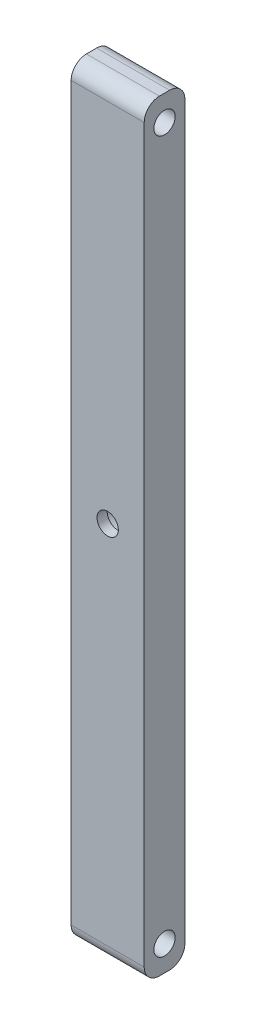
ISO-10303-21;
HEADER;
FILE_DESCRIPTION(('STEP AP214'),'2;1');
FILE_NAME('part.step','',(''),(''),'','','');
FILE_SCHEMA(('AUTOMOTIVE_DESIGN { 1 0 10303 214 1 1 1 1 }'));
ENDSEC;
DATA;
#1=APPLICATION_CONTEXT('core data for automotive mechanical design processes');
#2=APPLICATION_PROTOCOL_DEFINITION('international standard','automotive_design',2000,#1);
#3=PRODUCT_CONTEXT('',#1,'mechanical');
#4=PRODUCT('Part','Part','',(#3));
#5=PRODUCT_RELATED_PRODUCT_CATEGORY('part','',(#4));
#6=PRODUCT_DEFINITION_FORMATION('','',#4);
#7=PRODUCT_DEFINITION_CONTEXT('part definition',#1,'design');
#8=PRODUCT_DEFINITION('design','',#6,#7);
#9=PRODUCT_DEFINITION_SHAPE('','',#8);
#10=(LENGTH_UNIT() NAMED_UNIT(*) SI_UNIT(.MILLI.,.METRE.));
#11=(NAMED_UNIT(*) PLANE_ANGLE_UNIT() SI_UNIT($,.RADIAN.));
#12=(NAMED_UNIT(*) SI_UNIT($,.STERADIAN.) SOLID_ANGLE_UNIT());
#13=UNCERTAINTY_MEASURE_WITH_UNIT(LENGTH_MEASURE(1.E-05),#10,'distance_accuracy_value','');
#14=(GEOMETRIC_REPRESENTATION_CONTEXT(3) GLOBAL_UNCERTAINTY_ASSIGNED_CONTEXT((#13)) GLOBAL_UNIT_ASSIGNED_CONTEXT((#10,
#11,#12)) REPRESENTATION_CONTEXT('',''));
#15=CARTESIAN_POINT('',(0.,0.,0.));
#16=DIRECTION('',(0.,0.,1.));
#17=DIRECTION('',(1.,0.,0.));
#18=AXIS2_PLACEMENT_3D('',#15,#16,#17);
#19=CARTESIAN_POINT('',(0.,0.,-136.198862981558));
#20=DIRECTION('',(0.,0.,-1.));
#21=DIRECTION('',(-1.,0.,0.));
#22=AXIS2_PLACEMENT_3D('',#19,#20,#21);
#23=PLANE('',#22);
#24=CARTESIAN_POINT('',(52.7153260754915,163.447805518619,-136.198862981558));
#25=DIRECTION('',(0.,0.,-1.));
#26=DIRECTION('',(-1.,0.,0.));
#27=AXIS2_PLACEMENT_3D('',#24,#25,#26);
#28=CIRCLE('',#27,2.1);
#29=CARTESIAN_POINT('',(50.6153260754914,163.447805518619,-136.198862981558));
#30=VERTEX_POINT('',#29);
#31=EDGE_CURVE('E153',#30,#30,#28,.T.);
#32=ORIENTED_EDGE('',*,*,#31,.F.);
#33=EDGE_LOOP('',(#32));
#34=FACE_BOUND('',#33,.T.);
#35=CARTESIAN_POINT('',(52.7153260754915,163.447805518619,-136.198862981558));
#36=DIRECTION('',(0.,0.,-1.));
#37=DIRECTION('',(-1.,0.,0.));
#38=AXIS2_PLACEMENT_3D('',#35,#36,#37);
#39=CIRCLE('',#38,4.00000000000001);
#40=CARTESIAN_POINT('',(48.7153260754914,163.447805518619,-136.198862981558));
#41=VERTEX_POINT('',#40);
#42=EDGE_CURVE('E254',#41,#41,#39,.T.);
#43=ORIENTED_EDGE('',*,*,#42,.T.);
#44=EDGE_LOOP('',(#43));
#45=FACE_BOUND('',#44,.T.);
#46=ADVANCED_FACE('F41',(#34,#45),#23,.T.);
#47=CARTESIAN_POINT('',(0.,88.4478055186193,-136.198862981558));
#48=DIRECTION('',(0.,1.,0.));
#49=DIRECTION('',(0.,0.,1.));
#50=AXIS2_PLACEMENT_3D('',#47,#48,#49);
#51=PLANE('',#50);
#52=DIRECTION('',(0.,0.,1.));
#53=VECTOR('',#52,1.);
#54=CARTESIAN_POINT('',(59.9067960824093,88.4478055186193,-136.198862981558));
#55=LINE('',#54,#53);
#56=CARTESIAN_POINT('',(59.9067960824093,88.4478055186193,-139.198862981558));
#57=VERTEX_POINT('',#56);
#58=CARTESIAN_POINT('',(59.9067960824093,88.4478055186193,-137.198862981558));
#59=VERTEX_POINT('',#58);
#60=EDGE_CURVE('E149',#57,#59,#55,.T.);
#61=ORIENTED_EDGE('',*,*,#60,.T.);
#62=DIRECTION('',(-1.,0.,0.));
#63=VECTOR('',#62,1.);
#64=CARTESIAN_POINT('',(0.,88.4478055186193,-137.198862981558));
#65=LINE('',#64,#63);
#66=CARTESIAN_POINT('',(45.5238560685736,88.4478055186193,-137.198862981558));
#67=VERTEX_POINT('',#66);
#68=EDGE_CURVE('E11',#59,#67,#65,.T.);
#69=ORIENTED_EDGE('',*,*,#68,.T.);
#70=DIRECTION('',(0.,0.,1.));
#71=VECTOR('',#70,1.);
#72=CARTESIAN_POINT('',(45.5238560685736,88.4478055186193,-136.198862981558));
#73=LINE('',#72,#71);
#74=CARTESIAN_POINT('',(45.5238560685736,88.4478055186193,-139.198862981558));
#75=VERTEX_POINT('',#74);
#76=EDGE_CURVE('E122',#75,#67,#73,.T.);
#77=ORIENTED_EDGE('',*,*,#76,.F.);
#78=DIRECTION('',(-1.,0.,0.));
#79=VECTOR('',#78,1.);
#80=CARTESIAN_POINT('',(59.9067960824093,88.4478055186193,-139.198862981558));
#81=LINE('',#80,#79);
#82=EDGE_CURVE('E49',#75,#57,#81,.F.);
#83=ORIENTED_EDGE('',*,*,#82,.T.);
#84=EDGE_LOOP('',(#61,#69,#77,#83));
#85=FACE_BOUND('',#84,.T.);
#86=ADVANCED_FACE('F148',(#85),#51,.F.);
#87=CARTESIAN_POINT('',(45.5238560685736,0.,-136.198862981558));
#88=DIRECTION('',(1.,0.,0.));
#89=DIRECTION('',(0.,0.,-1.));
#90=AXIS2_PLACEMENT_3D('',#87,#88,#89);
#91=PLANE('',#90);
#92=CARTESIAN_POINT('',(45.5238560685736,93.4478055186193,-138.198862981558));
#93=DIRECTION('',(-1.,0.,0.));
#94=DIRECTION('',(0.,0.,1.));
#95=AXIS2_PLACEMENT_3D('',#92,#93,#94);
#96=CIRCLE('',#95,3.09999999999999);
#97=CARTESIAN_POINT('',(45.5238560685736,93.4478055186193,-135.098862981558));
#98=VERTEX_POINT('',#97);
#99=EDGE_CURVE('E238',#98,#98,#96,.T.);
#100=ORIENTED_EDGE('',*,*,#99,.F.);
#101=EDGE_LOOP('',(#100));
#102=FACE_BOUND('',#101,.T.);
#103=CARTESIAN_POINT('',(45.5238560685736,233.447805518619,-138.198862981558));
#104=DIRECTION('',(-1.,0.,0.));
#105=DIRECTION('',(0.,0.,1.));
#106=AXIS2_PLACEMENT_3D('',#103,#104,#105);
#107=CIRCLE('',#106,3.09999999999999);
#108=CARTESIAN_POINT('',(45.5238560685736,233.447805518619,-135.098862981558));
#109=VERTEX_POINT('',#108);
#110=EDGE_CURVE('E241',#109,#109,#107,.T.);
#111=ORIENTED_EDGE('',*,*,#110,.F.);
#112=EDGE_LOOP('',(#111));
#113=FACE_BOUND('',#112,.T.);
#114=DIRECTION('',(0.,1.,0.));
#115=VECTOR('',#114,1.);
#116=CARTESIAN_POINT('',(45.5238560685736,0.,-134.198862981558));
#117=LINE('',#116,#115);
#118=CARTESIAN_POINT('',(45.5238560685736,91.4478055186193,-134.198862981558));
#119=VERTEX_POINT('',#118);
#120=CARTESIAN_POINT('',(45.5238560685736,235.447805518619,-134.198862981558));
#121=VERTEX_POINT('',#120);
#122=EDGE_CURVE('E118',#119,#121,#117,.T.);
#123=ORIENTED_EDGE('',*,*,#122,.T.);
#124=CARTESIAN_POINT('',(45.5238560685736,235.447805518619,-137.198862981558));
#125=DIRECTION('',(1.,0.,0.));
#126=DIRECTION('',(0.,0.,-1.));
#127=AXIS2_PLACEMENT_3D('',#124,#125,#126);
#128=CIRCLE('',#127,3.);
#129=CARTESIAN_POINT('',(45.5238560685736,238.447805518619,-137.198862981558));
#130=VERTEX_POINT('',#129);
#131=EDGE_CURVE('E189',#121,#130,#128,.F.);
#132=ORIENTED_EDGE('',*,*,#131,.T.);
#133=DIRECTION('',(0.,0.,1.));
#134=VECTOR('',#133,1.);
#135=CARTESIAN_POINT('',(45.5238560685736,238.447805518619,-136.198862981558));
#136=LINE('',#135,#134);
#137=CARTESIAN_POINT('',(45.5238560685736,238.447805518619,-139.198862981558));
#138=VERTEX_POINT('',#137);
#139=EDGE_CURVE('E180',#138,#130,#136,.T.);
#140=ORIENTED_EDGE('',*,*,#139,.F.);
#141=CARTESIAN_POINT('',(45.5238560685736,235.447805518619,-139.198862981558));
#142=DIRECTION('',(1.,0.,0.));
#143=DIRECTION('',(0.,0.,-1.));
#144=AXIS2_PLACEMENT_3D('',#141,#142,#143);
#145=CIRCLE('',#144,3.);
#146=CARTESIAN_POINT('',(45.5238560685736,235.447805518619,-142.198862981558));
#147=VERTEX_POINT('',#146);
#148=EDGE_CURVE('E168',#138,#147,#145,.F.);
#149=ORIENTED_EDGE('',*,*,#148,.T.);
#150=DIRECTION('',(0.,1.,0.));
#151=VECTOR('',#150,1.);
#152=CARTESIAN_POINT('',(45.5238560685736,88.4478055186193,-142.198862981558));
#153=LINE('',#152,#151);
#154=CARTESIAN_POINT('',(45.5238560685736,91.4478055186193,-142.198862981558));
#155=VERTEX_POINT('',#154);
#156=EDGE_CURVE('E162',#155,#147,#153,.T.);
#157=ORIENTED_EDGE('',*,*,#156,.F.);
#158=CARTESIAN_POINT('',(45.5238560685736,91.4478055186193,-139.198862981558));
#159=DIRECTION('',(1.,0.,0.));
#160=DIRECTION('',(0.,0.,-1.));
#161=AXIS2_PLACEMENT_3D('',#158,#159,#160);
#162=CIRCLE('',#161,3.);
#163=EDGE_CURVE('E156',#155,#75,#162,.F.);
#164=ORIENTED_EDGE('',*,*,#163,.T.);
#165=ORIENTED_EDGE('',*,*,#76,.T.);
#166=CARTESIAN_POINT('',(45.5238560685736,91.4478055186193,-137.198862981558));
#167=DIRECTION('',(1.,0.,0.));
#168=DIRECTION('',(0.,0.,-1.));
#169=AXIS2_PLACEMENT_3D('',#166,#167,#168);
#170=CIRCLE('',#169,3.);
#171=EDGE_CURVE('E186',#67,#119,#170,.F.);
#172=ORIENTED_EDGE('',*,*,#171,.T.);
#173=EDGE_LOOP('',(#123,#132,#140,#149,#157,#164,#165,#172));
#174=FACE_BOUND('',#173,.T.);
#175=ADVANCED_FACE('F165',(#102,#113,#174),#91,.F.);
#176=CARTESIAN_POINT('',(0.,238.447805518619,-136.198862981558));
#177=DIRECTION('',(0.,1.,0.));
#178=DIRECTION('',(0.,0.,1.));
#179=AXIS2_PLACEMENT_3D('',#176,#177,#178);
#180=PLANE('',#179);
#181=ORIENTED_EDGE('',*,*,#139,.T.);
#182=DIRECTION('',(-1.,0.,0.));
#183=VECTOR('',#182,1.);
#184=CARTESIAN_POINT('',(59.9067960824093,238.447805518619,-137.198862981558));
#185=LINE('',#184,#183);
#186=CARTESIAN_POINT('',(59.9067960824093,238.447805518619,-137.198862981558));
#187=VERTEX_POINT('',#186);
#188=EDGE_CURVE('E136',#130,#187,#185,.F.);
#189=ORIENTED_EDGE('',*,*,#188,.T.);
#190=DIRECTION('',(0.,0.,1.));
#191=VECTOR('',#190,1.);
#192=CARTESIAN_POINT('',(59.9067960824093,238.447805518619,-136.198862981558));
#193=LINE('',#192,#191);
#194=CARTESIAN_POINT('',(59.9067960824093,238.447805518619,-139.198862981558));
#195=VERTEX_POINT('',#194);
#196=EDGE_CURVE('E152',#195,#187,#193,.T.);
#197=ORIENTED_EDGE('',*,*,#196,.F.);
#198=DIRECTION('',(1.,0.,0.));
#199=VECTOR('',#198,1.);
#200=CARTESIAN_POINT('',(0.,238.447805518619,-139.198862981558));
#201=LINE('',#200,#199);
#202=EDGE_CURVE('E191',#195,#138,#201,.F.);
#203=ORIENTED_EDGE('',*,*,#202,.T.);
#204=EDGE_LOOP('',(#181,#189,#197,#203));
#205=FACE_BOUND('',#204,.T.);
#206=ADVANCED_FACE('F195',(#205),#180,.T.);
#207=CARTESIAN_POINT('',(59.9067960824093,0.,-136.198862981558));
#208=DIRECTION('',(1.,0.,0.));
#209=DIRECTION('',(0.,0.,-1.));
#210=AXIS2_PLACEMENT_3D('',#207,#208,#209);
#211=PLANE('',#210);
#212=CARTESIAN_POINT('',(59.9067960824093,233.447805518619,-138.198862981558));
#213=DIRECTION('',(-1.,0.,0.));
#214=DIRECTION('',(0.,0.,1.));
#215=AXIS2_PLACEMENT_3D('',#212,#213,#214);
#216=CIRCLE('',#215,2.09999999999999);
#217=CARTESIAN_POINT('',(59.9067960824093,233.447805518619,-136.098862981558));
#218=VERTEX_POINT('',#217);
#219=EDGE_CURVE('E244',#218,#218,#216,.T.);
#220=ORIENTED_EDGE('',*,*,#219,.T.);
#221=EDGE_LOOP('',(#220));
#222=FACE_BOUND('',#221,.T.);
#223=CARTESIAN_POINT('',(59.9067960824093,93.4478055186193,-138.198862981558));
#224=DIRECTION('',(-1.,0.,0.));
#225=DIRECTION('',(0.,0.,1.));
#226=AXIS2_PLACEMENT_3D('',#223,#224,#225);
#227=CIRCLE('',#226,2.09999999999999);
#228=CARTESIAN_POINT('',(59.9067960824093,93.4478055186193,-136.098862981558));
#229=VERTEX_POINT('',#228);
#230=EDGE_CURVE('E266',#229,#229,#227,.T.);
#231=ORIENTED_EDGE('',*,*,#230,.T.);
#232=EDGE_LOOP('',(#231));
#233=FACE_BOUND('',#232,.T.);
#234=ORIENTED_EDGE('',*,*,#196,.T.);
#235=CARTESIAN_POINT('',(59.9067960824093,235.447805518619,-137.198862981558));
#236=DIRECTION('',(1.,0.,0.));
#237=DIRECTION('',(0.,0.,-1.));
#238=AXIS2_PLACEMENT_3D('',#235,#236,#237);
#239=CIRCLE('',#238,3.);
#240=CARTESIAN_POINT('',(59.9067960824093,235.447805518619,-134.198862981558));
#241=VERTEX_POINT('',#240);
#242=EDGE_CURVE('E129',#187,#241,#239,.T.);
#243=ORIENTED_EDGE('',*,*,#242,.T.);
#244=DIRECTION('',(0.,1.,0.));
#245=VECTOR('',#244,1.);
#246=CARTESIAN_POINT('',(59.9067960824093,0.,-134.198862981558));
#247=LINE('',#246,#245);
#248=CARTESIAN_POINT('',(59.9067960824093,91.4478055186193,-134.198862981558));
#249=VERTEX_POINT('',#248);
#250=EDGE_CURVE('E115',#249,#241,#247,.T.);
#251=ORIENTED_EDGE('',*,*,#250,.F.);
#252=CARTESIAN_POINT('',(59.9067960824093,91.4478055186193,-137.198862981558));
#253=DIRECTION('',(1.,0.,0.));
#254=DIRECTION('',(0.,0.,-1.));
#255=AXIS2_PLACEMENT_3D('',#252,#253,#254);
#256=CIRCLE('',#255,3.);
#257=EDGE_CURVE('E126',#249,#59,#256,.T.);
#258=ORIENTED_EDGE('',*,*,#257,.T.);
#259=ORIENTED_EDGE('',*,*,#60,.F.);
#260=CARTESIAN_POINT('',(59.9067960824093,91.4478055186193,-139.198862981558));
#261=DIRECTION('',(1.,0.,0.));
#262=DIRECTION('',(0.,0.,-1.));
#263=AXIS2_PLACEMENT_3D('',#260,#261,#262);
#264=CIRCLE('',#263,3.);
#265=CARTESIAN_POINT('',(59.9067960824093,91.4478055186193,-142.198862981558));
#266=VERTEX_POINT('',#265);
#267=EDGE_CURVE('E56',#57,#266,#264,.T.);
#268=ORIENTED_EDGE('',*,*,#267,.T.);
#269=DIRECTION('',(0.,-1.,0.));
#270=VECTOR('',#269,1.);
#271=CARTESIAN_POINT('',(59.9067960824093,238.447805518619,-142.198862981558));
#272=LINE('',#271,#270);
#273=CARTESIAN_POINT('',(59.9067960824093,235.447805518619,-142.198862981558));
#274=VERTEX_POINT('',#273);
#275=EDGE_CURVE('E163',#274,#266,#272,.T.);
#276=ORIENTED_EDGE('',*,*,#275,.F.);
#277=CARTESIAN_POINT('',(59.9067960824093,235.447805518619,-139.198862981558));
#278=DIRECTION('',(1.,0.,0.));
#279=DIRECTION('',(0.,0.,-1.));
#280=AXIS2_PLACEMENT_3D('',#277,#278,#279);
#281=CIRCLE('',#280,3.);
#282=EDGE_CURVE('E64',#274,#195,#281,.T.);
#283=ORIENTED_EDGE('',*,*,#282,.T.);
#284=EDGE_LOOP('',(#234,#243,#251,#258,#259,#268,#276,#283));
#285=FACE_BOUND('',#284,.T.);
#286=ADVANCED_FACE('F125',(#222,#233,#285),#211,.T.);
#287=CARTESIAN_POINT('',(52.7153260754915,163.447805518619,-136.198862981558));
#288=DIRECTION('',(0.,0.,1.));
#289=DIRECTION('',(1.,0.,0.));
#290=AXIS2_PLACEMENT_3D('',#287,#288,#289);
#291=CYLINDRICAL_SURFACE('',#290,2.1);
#292=ORIENTED_EDGE('',*,*,#31,.T.);
#293=EDGE_LOOP('',(#292));
#294=FACE_BOUND('',#293,.T.);
#295=CARTESIAN_POINT('',(52.7153260754915,163.447805518619,-134.198862981558));
#296=DIRECTION('',(0.,0.,-1.));
#297=DIRECTION('',(-1.,0.,0.));
#298=AXIS2_PLACEMENT_3D('',#295,#296,#297);
#299=CIRCLE('',#298,2.1);
#300=CARTESIAN_POINT('',(50.6153260754914,163.447805518619,-134.198862981558));
#301=VERTEX_POINT('',#300);
#302=EDGE_CURVE('E130',#301,#301,#299,.T.);
#303=ORIENTED_EDGE('',*,*,#302,.F.);
#304=EDGE_LOOP('',(#303));
#305=FACE_BOUND('',#304,.T.);
#306=ADVANCED_FACE('F223',(#294,#305),#291,.F.);
#307=CARTESIAN_POINT('',(0.,0.,-134.198862981558));
#308=DIRECTION('',(0.,0.,-1.));
#309=DIRECTION('',(-1.,0.,0.));
#310=AXIS2_PLACEMENT_3D('',#307,#308,#309);
#311=PLANE('',#310);
#312=ORIENTED_EDGE('',*,*,#250,.T.);
#313=DIRECTION('',(-1.,0.,0.));
#314=VECTOR('',#313,1.);
#315=CARTESIAN_POINT('',(45.5238560685736,235.447805518619,-134.198862981558));
#316=LINE('',#315,#314);
#317=EDGE_CURVE('E121',#241,#121,#316,.T.);
#318=ORIENTED_EDGE('',*,*,#317,.T.);
#319=ORIENTED_EDGE('',*,*,#122,.F.);
#320=DIRECTION('',(-1.,0.,0.));
#321=VECTOR('',#320,1.);
#322=CARTESIAN_POINT('',(0.,91.4478055186193,-134.198862981558));
#323=LINE('',#322,#321);
#324=EDGE_CURVE('E110',#119,#249,#323,.F.);
#325=ORIENTED_EDGE('',*,*,#324,.T.);
#326=EDGE_LOOP('',(#312,#318,#319,#325));
#327=FACE_BOUND('',#326,.T.);
#328=ORIENTED_EDGE('',*,*,#302,.T.);
#329=EDGE_LOOP('',(#328));
#330=FACE_BOUND('',#329,.T.);
#331=ADVANCED_FACE('F112',(#327,#330),#311,.F.);
#332=CARTESIAN_POINT('',(0.,0.,-142.198862981558));
#333=DIRECTION('',(0.,0.,-1.));
#334=DIRECTION('',(-1.,0.,0.));
#335=AXIS2_PLACEMENT_3D('',#332,#333,#334);
#336=PLANE('',#335);
#337=ORIENTED_EDGE('',*,*,#156,.T.);
#338=DIRECTION('',(1.,0.,0.));
#339=VECTOR('',#338,1.);
#340=CARTESIAN_POINT('',(0.,235.447805518619,-142.198862981558));
#341=LINE('',#340,#339);
#342=EDGE_CURVE('E144',#147,#274,#341,.T.);
#343=ORIENTED_EDGE('',*,*,#342,.T.);
#344=ORIENTED_EDGE('',*,*,#275,.T.);
#345=DIRECTION('',(-1.,0.,0.));
#346=VECTOR('',#345,1.);
#347=CARTESIAN_POINT('',(45.5238560685736,91.4478055186193,-142.198862981558));
#348=LINE('',#347,#346);
#349=EDGE_CURVE('E141',#266,#155,#348,.T.);
#350=ORIENTED_EDGE('',*,*,#349,.T.);
#351=EDGE_LOOP('',(#337,#343,#344,#350));
#352=FACE_BOUND('',#351,.T.);
#353=CARTESIAN_POINT('',(52.7153260754915,163.447805518619,-142.198862981558));
#354=DIRECTION('',(0.,0.,-1.));
#355=DIRECTION('',(-1.,0.,0.));
#356=AXIS2_PLACEMENT_3D('',#353,#354,#355);
#357=CIRCLE('',#356,4.00000000000001);
#358=CARTESIAN_POINT('',(48.7153260754914,163.447805518619,-142.198862981558));
#359=VERTEX_POINT('',#358);
#360=EDGE_CURVE('E171',#359,#359,#357,.T.);
#361=ORIENTED_EDGE('',*,*,#360,.F.);
#362=EDGE_LOOP('',(#361));
#363=FACE_BOUND('',#362,.T.);
#364=ADVANCED_FACE('F160',(#352,#363),#336,.T.);
#365=CARTESIAN_POINT('',(52.7153260754915,163.447805518619,-142.198862981558));
#366=DIRECTION('',(0.,0.,1.));
#367=DIRECTION('',(1.,0.,0.));
#368=AXIS2_PLACEMENT_3D('',#365,#366,#367);
#369=CYLINDRICAL_SURFACE('',#368,4.00000000000001);
#370=ORIENTED_EDGE('',*,*,#360,.T.);
#371=EDGE_LOOP('',(#370));
#372=FACE_BOUND('',#371,.T.);
#373=ORIENTED_EDGE('',*,*,#42,.F.);
#374=EDGE_LOOP('',(#373));
#375=FACE_BOUND('',#374,.T.);
#376=ADVANCED_FACE('F282',(#372,#375),#369,.F.);
#377=CARTESIAN_POINT('',(49.5238560685736,233.447805518619,-138.198862981558));
#378=DIRECTION('',(-1.,0.,0.));
#379=DIRECTION('',(0.,0.,1.));
#380=AXIS2_PLACEMENT_3D('',#377,#378,#379);
#381=CYLINDRICAL_SURFACE('',#380,3.09999999999999);
#382=CARTESIAN_POINT('',(49.5238560685736,233.447805518619,-138.198862981558));
#383=DIRECTION('',(-1.,0.,0.));
#384=DIRECTION('',(0.,0.,1.));
#385=AXIS2_PLACEMENT_3D('',#382,#383,#384);
#386=CIRCLE('',#385,3.09999999999999);
#387=CARTESIAN_POINT('',(49.5238560685736,233.447805518619,-135.098862981558));
#388=VERTEX_POINT('',#387);
#389=EDGE_CURVE('E243',#388,#388,#386,.T.);
#390=ORIENTED_EDGE('',*,*,#389,.F.);
#391=EDGE_LOOP('',(#390));
#392=FACE_BOUND('',#391,.T.);
#393=ORIENTED_EDGE('',*,*,#110,.T.);
#394=EDGE_LOOP('',(#393));
#395=FACE_BOUND('',#394,.T.);
#396=ADVANCED_FACE('F277',(#392,#395),#381,.F.);
#397=CARTESIAN_POINT('',(49.5238560685736,0.,0.));
#398=DIRECTION('',(-1.,0.,0.));
#399=DIRECTION('',(0.,0.,1.));
#400=AXIS2_PLACEMENT_3D('',#397,#398,#399);
#401=PLANE('',#400);
#402=CARTESIAN_POINT('',(49.5238560685736,233.447805518619,-138.198862981558));
#403=DIRECTION('',(-1.,0.,0.));
#404=DIRECTION('',(0.,0.,1.));
#405=AXIS2_PLACEMENT_3D('',#402,#403,#404);
#406=CIRCLE('',#405,2.09999999999999);
#407=CARTESIAN_POINT('',(49.5238560685736,233.447805518619,-136.098862981558));
#408=VERTEX_POINT('',#407);
#409=EDGE_CURVE('E249',#408,#408,#406,.T.);
#410=ORIENTED_EDGE('',*,*,#409,.F.);
#411=EDGE_LOOP('',(#410));
#412=FACE_BOUND('',#411,.T.);
#413=ORIENTED_EDGE('',*,*,#389,.T.);
#414=EDGE_LOOP('',(#413));
#415=FACE_BOUND('',#414,.T.);
#416=ADVANCED_FACE('F273',(#412,#415),#401,.T.);
#417=CARTESIAN_POINT('',(49.5238560685736,93.4478055186193,-138.198862981558));
#418=DIRECTION('',(-1.,0.,0.));
#419=DIRECTION('',(0.,0.,1.));
#420=AXIS2_PLACEMENT_3D('',#417,#418,#419);
#421=CYLINDRICAL_SURFACE('',#420,3.09999999999999);
#422=CARTESIAN_POINT('',(49.5238560685736,93.4478055186193,-138.198862981558));
#423=DIRECTION('',(-1.,0.,0.));
#424=DIRECTION('',(0.,0.,1.));
#425=AXIS2_PLACEMENT_3D('',#422,#423,#424);
#426=CIRCLE('',#425,3.09999999999999);
#427=CARTESIAN_POINT('',(49.5238560685736,93.4478055186193,-135.098862981558));
#428=VERTEX_POINT('',#427);
#429=EDGE_CURVE('E256',#428,#428,#426,.T.);
#430=ORIENTED_EDGE('',*,*,#429,.F.);
#431=EDGE_LOOP('',(#430));
#432=FACE_BOUND('',#431,.T.);
#433=ORIENTED_EDGE('',*,*,#99,.T.);
#434=EDGE_LOOP('',(#433));
#435=FACE_BOUND('',#434,.T.);
#436=ADVANCED_FACE('F276',(#432,#435),#421,.F.);
#437=CARTESIAN_POINT('',(49.5238560685736,0.,0.));
#438=DIRECTION('',(-1.,0.,0.));
#439=DIRECTION('',(0.,0.,1.));
#440=AXIS2_PLACEMENT_3D('',#437,#438,#439);
#441=PLANE('',#440);
#442=CARTESIAN_POINT('',(49.5238560685736,93.4478055186193,-138.198862981558));
#443=DIRECTION('',(-1.,0.,0.));
#444=DIRECTION('',(0.,0.,1.));
#445=AXIS2_PLACEMENT_3D('',#442,#443,#444);
#446=CIRCLE('',#445,2.09999999999999);
#447=CARTESIAN_POINT('',(49.5238560685736,93.4478055186193,-136.098862981558));
#448=VERTEX_POINT('',#447);
#449=EDGE_CURVE('E263',#448,#448,#446,.T.);
#450=ORIENTED_EDGE('',*,*,#449,.F.);
#451=EDGE_LOOP('',(#450));
#452=FACE_BOUND('',#451,.T.);
#453=ORIENTED_EDGE('',*,*,#429,.T.);
#454=EDGE_LOOP('',(#453));
#455=FACE_BOUND('',#454,.T.);
#456=ADVANCED_FACE('F290',(#452,#455),#441,.T.);
#457=CARTESIAN_POINT('',(59.9067960824093,93.4478055186193,-138.198862981558));
#458=DIRECTION('',(-1.,0.,0.));
#459=DIRECTION('',(0.,0.,1.));
#460=AXIS2_PLACEMENT_3D('',#457,#458,#459);
#461=CYLINDRICAL_SURFACE('',#460,2.09999999999999);
#462=ORIENTED_EDGE('',*,*,#230,.F.);
#463=EDGE_LOOP('',(#462));
#464=FACE_BOUND('',#463,.T.);
#465=ORIENTED_EDGE('',*,*,#449,.T.);
#466=EDGE_LOOP('',(#465));
#467=FACE_BOUND('',#466,.T.);
#468=ADVANCED_FACE('F294',(#464,#467),#461,.F.);
#469=CARTESIAN_POINT('',(59.9067960824093,233.447805518619,-138.198862981558));
#470=DIRECTION('',(-1.,0.,0.));
#471=DIRECTION('',(0.,0.,1.));
#472=AXIS2_PLACEMENT_3D('',#469,#470,#471);
#473=CYLINDRICAL_SURFACE('',#472,2.09999999999999);
#474=ORIENTED_EDGE('',*,*,#219,.F.);
#475=EDGE_LOOP('',(#474));
#476=FACE_BOUND('',#475,.T.);
#477=ORIENTED_EDGE('',*,*,#409,.T.);
#478=EDGE_LOOP('',(#477));
#479=FACE_BOUND('',#478,.T.);
#480=ADVANCED_FACE('F205',(#476,#479),#473,.F.);
#481=CARTESIAN_POINT('',(0.,235.447805518619,-137.198862981558));
#482=DIRECTION('',(1.,0.,0.));
#483=DIRECTION('',(0.,0.,-1.));
#484=AXIS2_PLACEMENT_3D('',#481,#482,#483);
#485=CYLINDRICAL_SURFACE('',#484,3.);
#486=ORIENTED_EDGE('',*,*,#242,.F.);
#487=ORIENTED_EDGE('',*,*,#188,.F.);
#488=ORIENTED_EDGE('',*,*,#131,.F.);
#489=ORIENTED_EDGE('',*,*,#317,.F.);
#490=EDGE_LOOP('',(#486,#487,#488,#489));
#491=FACE_BOUND('',#490,.T.);
#492=ADVANCED_FACE('F197',(#491),#485,.T.);
#493=CARTESIAN_POINT('',(0.,235.447805518619,-139.198862981558));
#494=DIRECTION('',(1.,0.,0.));
#495=DIRECTION('',(0.,0.,-1.));
#496=AXIS2_PLACEMENT_3D('',#493,#494,#495);
#497=CYLINDRICAL_SURFACE('',#496,3.);
#498=ORIENTED_EDGE('',*,*,#148,.F.);
#499=ORIENTED_EDGE('',*,*,#202,.F.);
#500=ORIENTED_EDGE('',*,*,#282,.F.);
#501=ORIENTED_EDGE('',*,*,#342,.F.);
#502=EDGE_LOOP('',(#498,#499,#500,#501));
#503=FACE_BOUND('',#502,.T.);
#504=ADVANCED_FACE('F198',(#503),#497,.T.);
#505=CARTESIAN_POINT('',(0.,91.4478055186193,-137.198862981558));
#506=DIRECTION('',(-1.,0.,0.));
#507=DIRECTION('',(0.,0.,1.));
#508=AXIS2_PLACEMENT_3D('',#505,#506,#507);
#509=CYLINDRICAL_SURFACE('',#508,3.);
#510=ORIENTED_EDGE('',*,*,#257,.F.);
#511=ORIENTED_EDGE('',*,*,#324,.F.);
#512=ORIENTED_EDGE('',*,*,#171,.F.);
#513=ORIENTED_EDGE('',*,*,#68,.F.);
#514=EDGE_LOOP('',(#510,#511,#512,#513));
#515=FACE_BOUND('',#514,.T.);
#516=ADVANCED_FACE('F133',(#515),#509,.T.);
#517=CARTESIAN_POINT('',(0.,91.4478055186193,-139.198862981558));
#518=DIRECTION('',(1.,0.,0.));
#519=DIRECTION('',(0.,0.,-1.));
#520=AXIS2_PLACEMENT_3D('',#517,#518,#519);
#521=CYLINDRICAL_SURFACE('',#520,3.);
#522=ORIENTED_EDGE('',*,*,#267,.F.);
#523=ORIENTED_EDGE('',*,*,#82,.F.);
#524=ORIENTED_EDGE('',*,*,#163,.F.);
#525=ORIENTED_EDGE('',*,*,#349,.F.);
#526=EDGE_LOOP('',(#522,#523,#524,#525));
#527=FACE_BOUND('',#526,.T.);
#528=ADVANCED_FACE('F43',(#527),#521,.T.);
#529=CLOSED_SHELL('',(#46,#86,#175,#206,#286,#306,#331,#364,#376,#396,#416,#436,#456,#468,#480,
#492,#504,#516,#528));
#530=MANIFOLD_SOLID_BREP('B2',#529);
#531=ADVANCED_BREP_SHAPE_REPRESENTATION('',(#18,#530),#14);
#532=SHAPE_DEFINITION_REPRESENTATION(#9,#531);
ENDSEC;
END-ISO-10303-21;
